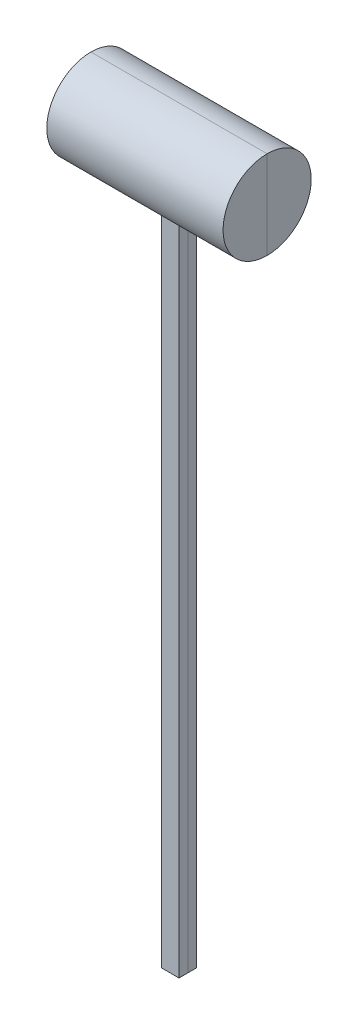
ISO-10303-21;
HEADER;
FILE_DESCRIPTION(('STEP AP214'),'2;1');
FILE_NAME('part.step','',(''),(''),'','','');
FILE_SCHEMA(('AUTOMOTIVE_DESIGN { 1 0 10303 214 1 1 1 1 }'));
ENDSEC;
DATA;
#1=APPLICATION_CONTEXT('core data for automotive mechanical design processes');
#2=APPLICATION_PROTOCOL_DEFINITION('international standard','automotive_design',2000,#1);
#3=PRODUCT_CONTEXT('',#1,'mechanical');
#4=PRODUCT('Part','Part','',(#3));
#5=PRODUCT_RELATED_PRODUCT_CATEGORY('part','',(#4));
#6=PRODUCT_DEFINITION_FORMATION('','',#4);
#7=PRODUCT_DEFINITION_CONTEXT('part definition',#1,'design');
#8=PRODUCT_DEFINITION('design','',#6,#7);
#9=PRODUCT_DEFINITION_SHAPE('','',#8);
#10=(LENGTH_UNIT() NAMED_UNIT(*) SI_UNIT(.MILLI.,.METRE.));
#11=(NAMED_UNIT(*) PLANE_ANGLE_UNIT() SI_UNIT($,.RADIAN.));
#12=(NAMED_UNIT(*) SI_UNIT($,.STERADIAN.) SOLID_ANGLE_UNIT());
#13=UNCERTAINTY_MEASURE_WITH_UNIT(LENGTH_MEASURE(1.E-05),#10,'distance_accuracy_value','');
#14=(GEOMETRIC_REPRESENTATION_CONTEXT(3) GLOBAL_UNCERTAINTY_ASSIGNED_CONTEXT((#13)) GLOBAL_UNIT_ASSIGNED_CONTEXT((#10,
#11,#12)) REPRESENTATION_CONTEXT('',''));
#15=CARTESIAN_POINT('',(0.,0.,0.));
#16=DIRECTION('',(0.,0.,1.));
#17=DIRECTION('',(1.,0.,0.));
#18=AXIS2_PLACEMENT_3D('',#15,#16,#17);
#19=CARTESIAN_POINT('',(0.,0.,0.));
#20=DIRECTION('',(0.,0.,1.));
#21=DIRECTION('',(1.,0.,0.));
#22=AXIS2_PLACEMENT_3D('',#19,#20,#21);
#23=PLANE('',#22);
#24=DIRECTION('',(0.,-1.,0.));
#25=VECTOR('',#24,1.);
#26=CARTESIAN_POINT('',(10.,0.,0.));
#27=LINE('',#26,#25);
#28=CARTESIAN_POINT('',(10.,5.,0.));
#29=VERTEX_POINT('',#28);
#30=CARTESIAN_POINT('',(10.,-5.,0.));
#31=VERTEX_POINT('',#30);
#32=EDGE_CURVE('E129',#29,#31,#27,.T.);
#33=ORIENTED_EDGE('',*,*,#32,.F.);
#34=DIRECTION('',(-1.,0.,0.));
#35=VECTOR('',#34,1.);
#36=CARTESIAN_POINT('',(10.,5.,0.));
#37=LINE('',#36,#35);
#38=CARTESIAN_POINT('',(-10.,5.,0.));
#39=VERTEX_POINT('',#38);
#40=EDGE_CURVE('E138',#29,#39,#37,.T.);
#41=ORIENTED_EDGE('',*,*,#40,.T.);
#42=DIRECTION('',(0.,-1.,0.));
#43=VECTOR('',#42,1.);
#44=CARTESIAN_POINT('',(-10.,0.,0.));
#45=LINE('',#44,#43);
#46=CARTESIAN_POINT('',(-10.,-5.,0.));
#47=VERTEX_POINT('',#46);
#48=EDGE_CURVE('E119',#39,#47,#45,.T.);
#49=ORIENTED_EDGE('',*,*,#48,.T.);
#50=DIRECTION('',(-1.,0.,0.));
#51=VECTOR('',#50,1.);
#52=CARTESIAN_POINT('',(10.,-5.,0.));
#53=LINE('',#52,#51);
#54=CARTESIAN_POINT('',(-0.999999999999999,-5.,0.));
#55=VERTEX_POINT('',#54);
#56=EDGE_CURVE('E118',#47,#55,#53,.F.);
#57=ORIENTED_EDGE('',*,*,#56,.T.);
#58=DIRECTION('',(0.,-1.,0.));
#59=VECTOR('',#58,1.);
#60=CARTESIAN_POINT('',(-1.,0.,0.));
#61=LINE('',#60,#59);
#62=CARTESIAN_POINT('',(-0.99999999999999,-80.,0.));
#63=VERTEX_POINT('',#62);
#64=EDGE_CURVE('E125',#55,#63,#61,.T.);
#65=ORIENTED_EDGE('',*,*,#64,.T.);
#66=DIRECTION('',(1.,0.,0.));
#67=VECTOR('',#66,1.);
#68=CARTESIAN_POINT('',(-0.99999999999999,-80.,0.));
#69=LINE('',#68,#67);
#70=CARTESIAN_POINT('',(1.00000000000002,-80.,0.));
#71=VERTEX_POINT('',#70);
#72=EDGE_CURVE('E123',#63,#71,#69,.T.);
#73=ORIENTED_EDGE('',*,*,#72,.T.);
#74=DIRECTION('',(0.,1.,0.));
#75=VECTOR('',#74,1.);
#76=CARTESIAN_POINT('',(1.,0.,0.));
#77=LINE('',#76,#75);
#78=CARTESIAN_POINT('',(1.,-5.,0.));
#79=VERTEX_POINT('',#78);
#80=EDGE_CURVE('E101',#71,#79,#77,.T.);
#81=ORIENTED_EDGE('',*,*,#80,.T.);
#82=EDGE_CURVE('E112',#79,#31,#53,.F.);
#83=ORIENTED_EDGE('',*,*,#82,.T.);
#84=EDGE_LOOP('',(#33,#41,#49,#57,#65,#73,#81,#83));
#85=FACE_BOUND('',#84,.T.);
#86=ADVANCED_FACE('F46',(#85),#23,.T.);
#87=CARTESIAN_POINT('',(10.,0.,0.));
#88=DIRECTION('',(-1.,0.,0.));
#89=DIRECTION('',(0.,0.,1.));
#90=AXIS2_PLACEMENT_3D('',#87,#88,#89);
#91=CYLINDRICAL_SURFACE('',#90,5.);
#92=ORIENTED_EDGE('',*,*,#40,.F.);
#93=CARTESIAN_POINT('',(10.,0.,0.));
#94=DIRECTION('',(1.,0.,0.));
#95=DIRECTION('',(0.,0.,-1.));
#96=AXIS2_PLACEMENT_3D('',#93,#94,#95);
#97=CIRCLE('',#96,5.);
#98=EDGE_CURVE('E116',#31,#29,#97,.T.);
#99=ORIENTED_EDGE('',*,*,#98,.F.);
#100=ORIENTED_EDGE('',*,*,#82,.F.);
#101=CARTESIAN_POINT('',(0.999999999999999,0.,0.));
#102=DIRECTION('',(-1.,0.,0.));
#103=DIRECTION('',(0.,-1.,0.));
#104=AXIS2_PLACEMENT_3D('',#101,#102,#103);
#105=CIRCLE('',#104,5.);
#106=CARTESIAN_POINT('',(1.,-4.89897948556635,-1.));
#107=VERTEX_POINT('',#106);
#108=EDGE_CURVE('E97',#107,#79,#105,.T.);
#109=ORIENTED_EDGE('',*,*,#108,.F.);
#110=DIRECTION('',(-1.,0.,0.));
#111=VECTOR('',#110,1.);
#112=CARTESIAN_POINT('',(10.,-4.89897948556635,-1.));
#113=LINE('',#112,#111);
#114=CARTESIAN_POINT('',(-1.,-4.89897948556635,-1.));
#115=VERTEX_POINT('',#114);
#116=EDGE_CURVE('E107',#115,#107,#113,.F.);
#117=ORIENTED_EDGE('',*,*,#116,.F.);
#118=CARTESIAN_POINT('',(-0.999999999999999,0.,0.));
#119=DIRECTION('',(1.,0.,0.));
#120=DIRECTION('',(0.,1.,0.));
#121=AXIS2_PLACEMENT_3D('',#118,#119,#120);
#122=CIRCLE('',#121,5.);
#123=EDGE_CURVE('E108',#55,#115,#122,.T.);
#124=ORIENTED_EDGE('',*,*,#123,.F.);
#125=ORIENTED_EDGE('',*,*,#56,.F.);
#126=CARTESIAN_POINT('',(-10.,0.,0.));
#127=DIRECTION('',(1.,0.,0.));
#128=DIRECTION('',(0.,0.,-1.));
#129=AXIS2_PLACEMENT_3D('',#126,#127,#128);
#130=CIRCLE('',#129,5.);
#131=EDGE_CURVE('E132',#47,#39,#130,.T.);
#132=ORIENTED_EDGE('',*,*,#131,.T.);
#133=EDGE_LOOP('',(#92,#99,#100,#109,#117,#124,#125,#132));
#134=FACE_BOUND('',#133,.T.);
#135=ADVANCED_FACE('F114',(#134),#91,.T.);
#136=CARTESIAN_POINT('',(10.,0.,0.));
#137=DIRECTION('',(1.,0.,0.));
#138=DIRECTION('',(0.,0.,-1.));
#139=AXIS2_PLACEMENT_3D('',#136,#137,#138);
#140=PLANE('',#139);
#141=ORIENTED_EDGE('',*,*,#98,.T.);
#142=ORIENTED_EDGE('',*,*,#32,.T.);
#143=EDGE_LOOP('',(#141,#142));
#144=FACE_BOUND('',#143,.T.);
#145=ADVANCED_FACE('F48',(#144),#140,.T.);
#146=CARTESIAN_POINT('',(-10.,0.,0.));
#147=DIRECTION('',(1.,0.,0.));
#148=DIRECTION('',(0.,0.,-1.));
#149=AXIS2_PLACEMENT_3D('',#146,#147,#148);
#150=PLANE('',#149);
#151=ORIENTED_EDGE('',*,*,#48,.F.);
#152=ORIENTED_EDGE('',*,*,#131,.F.);
#153=EDGE_LOOP('',(#151,#152));
#154=FACE_BOUND('',#153,.T.);
#155=ADVANCED_FACE('F153',(#154),#150,.F.);
#156=CARTESIAN_POINT('',(-1.,0.,1.));
#157=DIRECTION('',(1.,0.,0.));
#158=DIRECTION('',(0.,1.,0.));
#159=AXIS2_PLACEMENT_3D('',#156,#157,#158);
#160=PLANE('',#159);
#161=ORIENTED_EDGE('',*,*,#64,.F.);
#162=ORIENTED_EDGE('',*,*,#123,.T.);
#163=DIRECTION('',(0.,-1.,0.));
#164=VECTOR('',#163,1.);
#165=CARTESIAN_POINT('',(-1.,0.,-1.));
#166=LINE('',#165,#164);
#167=CARTESIAN_POINT('',(-0.99999999999999,-80.,-1.));
#168=VERTEX_POINT('',#167);
#169=EDGE_CURVE('E12',#115,#168,#166,.T.);
#170=ORIENTED_EDGE('',*,*,#169,.T.);
#171=DIRECTION('',(0.,0.,-1.));
#172=VECTOR('',#171,1.);
#173=CARTESIAN_POINT('',(-0.99999999999999,-80.,1.));
#174=LINE('',#173,#172);
#175=EDGE_CURVE('E63',#63,#168,#174,.T.);
#176=ORIENTED_EDGE('',*,*,#175,.F.);
#177=EDGE_LOOP('',(#161,#162,#170,#176));
#178=FACE_BOUND('',#177,.T.);
#179=ADVANCED_FACE('F151',(#178),#160,.F.);
#180=CARTESIAN_POINT('',(-0.99999999999999,-80.,1.));
#181=DIRECTION('',(0.,1.,0.));
#182=DIRECTION('',(0.,0.,1.));
#183=AXIS2_PLACEMENT_3D('',#180,#181,#182);
#184=PLANE('',#183);
#185=ORIENTED_EDGE('',*,*,#72,.F.);
#186=ORIENTED_EDGE('',*,*,#175,.T.);
#187=DIRECTION('',(1.,0.,0.));
#188=VECTOR('',#187,1.);
#189=CARTESIAN_POINT('',(-0.99999999999999,-80.,-1.));
#190=LINE('',#189,#188);
#191=CARTESIAN_POINT('',(1.00000000000002,-80.,-1.));
#192=VERTEX_POINT('',#191);
#193=EDGE_CURVE('E55',#168,#192,#190,.T.);
#194=ORIENTED_EDGE('',*,*,#193,.T.);
#195=DIRECTION('',(0.,0.,-1.));
#196=VECTOR('',#195,1.);
#197=CARTESIAN_POINT('',(1.00000000000002,-80.,1.));
#198=LINE('',#197,#196);
#199=EDGE_CURVE('E50',#71,#192,#198,.T.);
#200=ORIENTED_EDGE('',*,*,#199,.F.);
#201=EDGE_LOOP('',(#185,#186,#194,#200));
#202=FACE_BOUND('',#201,.T.);
#203=ADVANCED_FACE('F146',(#202),#184,.F.);
#204=CARTESIAN_POINT('',(1.,0.,1.));
#205=DIRECTION('',(-1.,0.,0.));
#206=DIRECTION('',(0.,-1.,0.));
#207=AXIS2_PLACEMENT_3D('',#204,#205,#206);
#208=PLANE('',#207);
#209=ORIENTED_EDGE('',*,*,#80,.F.);
#210=ORIENTED_EDGE('',*,*,#199,.T.);
#211=DIRECTION('',(0.,1.,0.));
#212=VECTOR('',#211,1.);
#213=CARTESIAN_POINT('',(1.,0.,-1.));
#214=LINE('',#213,#212);
#215=EDGE_CURVE('E103',#192,#107,#214,.T.);
#216=ORIENTED_EDGE('',*,*,#215,.T.);
#217=ORIENTED_EDGE('',*,*,#108,.T.);
#218=EDGE_LOOP('',(#209,#210,#216,#217));
#219=FACE_BOUND('',#218,.T.);
#220=ADVANCED_FACE('F99',(#219),#208,.F.);
#221=CARTESIAN_POINT('',(0.,0.,-1.));
#222=DIRECTION('',(0.,0.,1.));
#223=DIRECTION('',(1.,0.,0.));
#224=AXIS2_PLACEMENT_3D('',#221,#222,#223);
#225=PLANE('',#224);
#226=ORIENTED_EDGE('',*,*,#169,.F.);
#227=ORIENTED_EDGE('',*,*,#116,.T.);
#228=ORIENTED_EDGE('',*,*,#215,.F.);
#229=ORIENTED_EDGE('',*,*,#193,.F.);
#230=EDGE_LOOP('',(#226,#227,#228,#229));
#231=FACE_BOUND('',#230,.T.);
#232=ADVANCED_FACE('F150',(#231),#225,.F.);
#233=CLOSED_SHELL('',(#86,#135,#145,#155,#179,#203,#220,#232));
#234=MANIFOLD_SOLID_BREP('B2',#233);
#235=CARTESIAN_POINT('',(0.,0.,0.));
#236=DIRECTION('',(0.,0.,1.));
#237=DIRECTION('',(1.,0.,0.));
#238=AXIS2_PLACEMENT_3D('',#235,#236,#237);
#239=PLANE('',#238);
#240=DIRECTION('',(0.,-1.,0.));
#241=VECTOR('',#240,1.);
#242=CARTESIAN_POINT('',(10.,0.,0.));
#243=LINE('',#242,#241);
#244=CARTESIAN_POINT('',(10.,5.,0.));
#245=VERTEX_POINT('',#244);
#246=CARTESIAN_POINT('',(10.,-5.,0.));
#247=VERTEX_POINT('',#246);
#248=EDGE_CURVE('E44',#245,#247,#243,.T.);
#249=ORIENTED_EDGE('',*,*,#248,.T.);
#250=DIRECTION('',(-1.,0.,0.));
#251=VECTOR('',#250,1.);
#252=CARTESIAN_POINT('',(10.,-5.,0.));
#253=LINE('',#252,#251);
#254=CARTESIAN_POINT('',(1.,-5.,0.));
#255=VERTEX_POINT('',#254);
#256=EDGE_CURVE('E242',#255,#247,#253,.F.);
#257=ORIENTED_EDGE('',*,*,#256,.F.);
#258=DIRECTION('',(0.,1.,0.));
#259=VECTOR('',#258,1.);
#260=CARTESIAN_POINT('',(1.,0.,0.));
#261=LINE('',#260,#259);
#262=CARTESIAN_POINT('',(1.00000000000002,-80.,0.));
#263=VERTEX_POINT('',#262);
#264=EDGE_CURVE('E314',#263,#255,#261,.T.);
#265=ORIENTED_EDGE('',*,*,#264,.F.);
#266=DIRECTION('',(1.,0.,0.));
#267=VECTOR('',#266,1.);
#268=CARTESIAN_POINT('',(-0.99999999999999,-80.,0.));
#269=LINE('',#268,#267);
#270=CARTESIAN_POINT('',(-0.99999999999999,-80.,0.));
#271=VERTEX_POINT('',#270);
#272=EDGE_CURVE('E316',#271,#263,#269,.T.);
#273=ORIENTED_EDGE('',*,*,#272,.F.);
#274=DIRECTION('',(0.,-1.,0.));
#275=VECTOR('',#274,1.);
#276=CARTESIAN_POINT('',(-1.,0.,0.));
#277=LINE('',#276,#275);
#278=CARTESIAN_POINT('',(-0.999999999999999,-5.,0.));
#279=VERTEX_POINT('',#278);
#280=EDGE_CURVE('E297',#279,#271,#277,.T.);
#281=ORIENTED_EDGE('',*,*,#280,.F.);
#282=CARTESIAN_POINT('',(-10.,-5.,0.));
#283=VERTEX_POINT('',#282);
#284=EDGE_CURVE('E320',#283,#279,#253,.F.);
#285=ORIENTED_EDGE('',*,*,#284,.F.);
#286=DIRECTION('',(0.,-1.,0.));
#287=VECTOR('',#286,1.);
#288=CARTESIAN_POINT('',(-10.,0.,0.));
#289=LINE('',#288,#287);
#290=CARTESIAN_POINT('',(-10.,5.,0.));
#291=VERTEX_POINT('',#290);
#292=EDGE_CURVE('E319',#291,#283,#289,.T.);
#293=ORIENTED_EDGE('',*,*,#292,.F.);
#294=DIRECTION('',(-1.,0.,0.));
#295=VECTOR('',#294,1.);
#296=CARTESIAN_POINT('',(10.,5.,0.));
#297=LINE('',#296,#295);
#298=EDGE_CURVE('E225',#245,#291,#297,.T.);
#299=ORIENTED_EDGE('',*,*,#298,.F.);
#300=EDGE_LOOP('',(#249,#257,#265,#273,#281,#285,#293,#299));
#301=FACE_BOUND('',#300,.T.);
#302=ADVANCED_FACE('F222',(#301),#239,.F.);
#303=CARTESIAN_POINT('',(-1.,0.,1.));
#304=DIRECTION('',(1.,0.,0.));
#305=DIRECTION('',(0.,1.,0.));
#306=AXIS2_PLACEMENT_3D('',#303,#304,#305);
#307=PLANE('',#306);
#308=CARTESIAN_POINT('',(-0.999999999999999,0.,0.));
#309=DIRECTION('',(1.,0.,0.));
#310=DIRECTION('',(0.,1.,0.));
#311=AXIS2_PLACEMENT_3D('',#308,#309,#310);
#312=CIRCLE('',#311,5.);
#313=CARTESIAN_POINT('',(-0.999999999999999,-4.89897948556635,1.));
#314=VERTEX_POINT('',#313);
#315=EDGE_CURVE('E311',#314,#279,#312,.T.);
#316=ORIENTED_EDGE('',*,*,#315,.T.);
#317=ORIENTED_EDGE('',*,*,#280,.T.);
#318=DIRECTION('',(0.,0.,-1.));
#319=VECTOR('',#318,1.);
#320=CARTESIAN_POINT('',(-0.99999999999999,-80.,1.));
#321=LINE('',#320,#319);
#322=CARTESIAN_POINT('',(-0.99999999999999,-80.,1.));
#323=VERTEX_POINT('',#322);
#324=EDGE_CURVE('E289',#323,#271,#321,.T.);
#325=ORIENTED_EDGE('',*,*,#324,.F.);
#326=DIRECTION('',(0.,-1.,0.));
#327=VECTOR('',#326,1.);
#328=CARTESIAN_POINT('',(-1.,0.,1.));
#329=LINE('',#328,#327);
#330=EDGE_CURVE('E274',#314,#323,#329,.T.);
#331=ORIENTED_EDGE('',*,*,#330,.F.);
#332=EDGE_LOOP('',(#316,#317,#325,#331));
#333=FACE_BOUND('',#332,.T.);
#334=ADVANCED_FACE('F295',(#333),#307,.F.);
#335=CARTESIAN_POINT('',(0.,0.,1.));
#336=DIRECTION('',(0.,0.,1.));
#337=DIRECTION('',(1.,0.,0.));
#338=AXIS2_PLACEMENT_3D('',#335,#336,#337);
#339=PLANE('',#338);
#340=DIRECTION('',(-1.,0.,0.));
#341=VECTOR('',#340,1.);
#342=CARTESIAN_POINT('',(10.,-4.89897948556635,1.));
#343=LINE('',#342,#341);
#344=CARTESIAN_POINT('',(1.,-4.89897948556635,1.));
#345=VERTEX_POINT('',#344);
#346=EDGE_CURVE('E281',#314,#345,#343,.F.);
#347=ORIENTED_EDGE('',*,*,#346,.F.);
#348=ORIENTED_EDGE('',*,*,#330,.T.);
#349=DIRECTION('',(1.,0.,0.));
#350=VECTOR('',#349,1.);
#351=CARTESIAN_POINT('',(-0.99999999999999,-80.,1.));
#352=LINE('',#351,#350);
#353=CARTESIAN_POINT('',(1.00000000000002,-80.,1.));
#354=VERTEX_POINT('',#353);
#355=EDGE_CURVE('E278',#323,#354,#352,.T.);
#356=ORIENTED_EDGE('',*,*,#355,.T.);
#357=DIRECTION('',(0.,1.,0.));
#358=VECTOR('',#357,1.);
#359=CARTESIAN_POINT('',(1.,0.,1.));
#360=LINE('',#359,#358);
#361=EDGE_CURVE('E293',#354,#345,#360,.T.);
#362=ORIENTED_EDGE('',*,*,#361,.T.);
#363=EDGE_LOOP('',(#347,#348,#356,#362));
#364=FACE_BOUND('',#363,.T.);
#365=ADVANCED_FACE('F276',(#364),#339,.T.);
#366=CARTESIAN_POINT('',(10.,0.,0.));
#367=DIRECTION('',(-1.,0.,0.));
#368=DIRECTION('',(0.,0.,1.));
#369=AXIS2_PLACEMENT_3D('',#366,#367,#368);
#370=CYLINDRICAL_SURFACE('',#369,5.);
#371=CARTESIAN_POINT('',(10.,0.,0.));
#372=DIRECTION('',(1.,0.,0.));
#373=DIRECTION('',(0.,0.,-1.));
#374=AXIS2_PLACEMENT_3D('',#371,#372,#373);
#375=CIRCLE('',#374,5.);
#376=EDGE_CURVE('E302',#245,#247,#375,.T.);
#377=ORIENTED_EDGE('',*,*,#376,.F.);
#378=ORIENTED_EDGE('',*,*,#298,.T.);
#379=CARTESIAN_POINT('',(-10.,0.,0.));
#380=DIRECTION('',(1.,0.,0.));
#381=DIRECTION('',(0.,0.,-1.));
#382=AXIS2_PLACEMENT_3D('',#379,#380,#381);
#383=CIRCLE('',#382,5.);
#384=EDGE_CURVE('E299',#291,#283,#383,.T.);
#385=ORIENTED_EDGE('',*,*,#384,.T.);
#386=ORIENTED_EDGE('',*,*,#284,.T.);
#387=ORIENTED_EDGE('',*,*,#315,.F.);
#388=ORIENTED_EDGE('',*,*,#346,.T.);
#389=CARTESIAN_POINT('',(0.999999999999999,0.,0.));
#390=DIRECTION('',(-1.,0.,0.));
#391=DIRECTION('',(0.,-1.,0.));
#392=AXIS2_PLACEMENT_3D('',#389,#390,#391);
#393=CIRCLE('',#392,5.);
#394=EDGE_CURVE('E308',#255,#345,#393,.T.);
#395=ORIENTED_EDGE('',*,*,#394,.F.);
#396=ORIENTED_EDGE('',*,*,#256,.T.);
#397=EDGE_LOOP('',(#377,#378,#385,#386,#387,#388,#395,#396));
#398=FACE_BOUND('',#397,.T.);
#399=ADVANCED_FACE('F326',(#398),#370,.T.);
#400=CARTESIAN_POINT('',(-0.99999999999999,-80.,1.));
#401=DIRECTION('',(0.,1.,0.));
#402=DIRECTION('',(0.,0.,1.));
#403=AXIS2_PLACEMENT_3D('',#400,#401,#402);
#404=PLANE('',#403);
#405=ORIENTED_EDGE('',*,*,#324,.T.);
#406=ORIENTED_EDGE('',*,*,#272,.T.);
#407=DIRECTION('',(0.,0.,-1.));
#408=VECTOR('',#407,1.);
#409=CARTESIAN_POINT('',(1.00000000000002,-80.,1.));
#410=LINE('',#409,#408);
#411=EDGE_CURVE('E291',#354,#263,#410,.T.);
#412=ORIENTED_EDGE('',*,*,#411,.F.);
#413=ORIENTED_EDGE('',*,*,#355,.F.);
#414=EDGE_LOOP('',(#405,#406,#412,#413));
#415=FACE_BOUND('',#414,.T.);
#416=ADVANCED_FACE('F288',(#415),#404,.F.);
#417=CARTESIAN_POINT('',(1.,0.,1.));
#418=DIRECTION('',(-1.,0.,0.));
#419=DIRECTION('',(0.,-1.,0.));
#420=AXIS2_PLACEMENT_3D('',#417,#418,#419);
#421=PLANE('',#420);
#422=ORIENTED_EDGE('',*,*,#411,.T.);
#423=ORIENTED_EDGE('',*,*,#264,.T.);
#424=ORIENTED_EDGE('',*,*,#394,.T.);
#425=ORIENTED_EDGE('',*,*,#361,.F.);
#426=EDGE_LOOP('',(#422,#423,#424,#425));
#427=FACE_BOUND('',#426,.T.);
#428=ADVANCED_FACE('F331',(#427),#421,.F.);
#429=CARTESIAN_POINT('',(-10.,0.,0.));
#430=DIRECTION('',(1.,0.,0.));
#431=DIRECTION('',(0.,0.,-1.));
#432=AXIS2_PLACEMENT_3D('',#429,#430,#431);
#433=PLANE('',#432);
#434=ORIENTED_EDGE('',*,*,#384,.F.);
#435=ORIENTED_EDGE('',*,*,#292,.T.);
#436=EDGE_LOOP('',(#434,#435));
#437=FACE_BOUND('',#436,.T.);
#438=ADVANCED_FACE('F325',(#437),#433,.F.);
#439=CARTESIAN_POINT('',(10.,0.,0.));
#440=DIRECTION('',(1.,0.,0.));
#441=DIRECTION('',(0.,0.,-1.));
#442=AXIS2_PLACEMENT_3D('',#439,#440,#441);
#443=PLANE('',#442);
#444=ORIENTED_EDGE('',*,*,#248,.F.);
#445=ORIENTED_EDGE('',*,*,#376,.T.);
#446=EDGE_LOOP('',(#444,#445));
#447=FACE_BOUND('',#446,.T.);
#448=ADVANCED_FACE('F328',(#447),#443,.T.);
#449=CLOSED_SHELL('',(#302,#334,#365,#399,#416,#428,#438,#448));
#450=MANIFOLD_SOLID_BREP('B6',#449);
#451=ADVANCED_BREP_SHAPE_REPRESENTATION('',(#18,#234,#450),#14);
#452=SHAPE_DEFINITION_REPRESENTATION(#9,#451);
ENDSEC;
END-ISO-10303-21;
